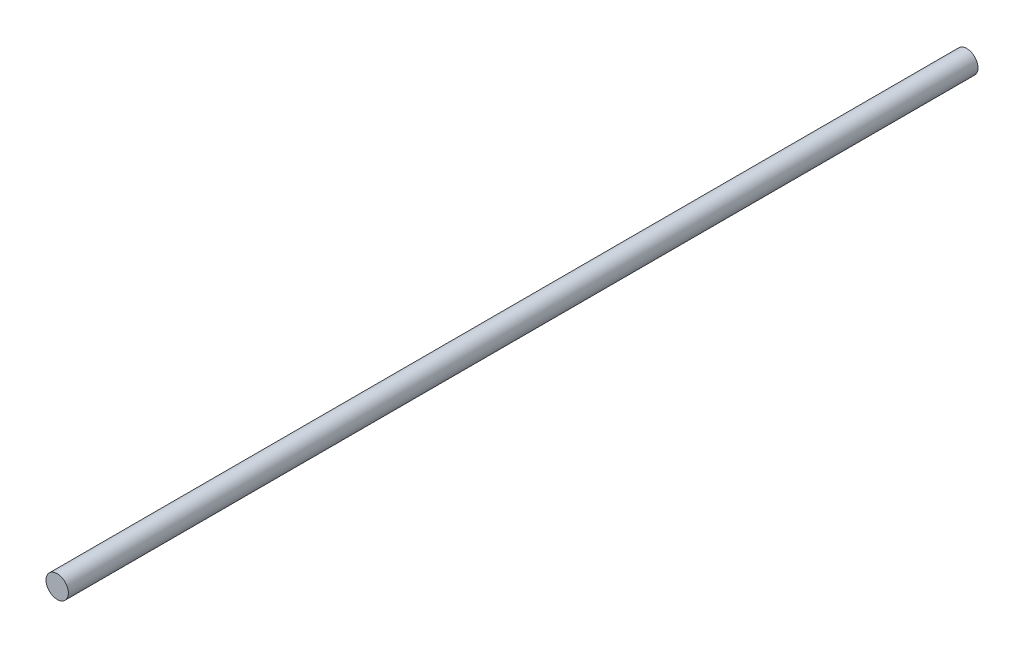
ISO-10303-21;
HEADER;
FILE_DESCRIPTION(('STEP AP214'),'2;1');
FILE_NAME('part.step','',(''),(''),'','','');
FILE_SCHEMA(('AUTOMOTIVE_DESIGN { 1 0 10303 214 1 1 1 1 }'));
ENDSEC;
DATA;
#1=APPLICATION_CONTEXT('core data for automotive mechanical design processes');
#2=APPLICATION_PROTOCOL_DEFINITION('international standard','automotive_design',2000,#1);
#3=PRODUCT_CONTEXT('',#1,'mechanical');
#4=PRODUCT('Part','Part','',(#3));
#5=PRODUCT_RELATED_PRODUCT_CATEGORY('part','',(#4));
#6=PRODUCT_DEFINITION_FORMATION('','',#4);
#7=PRODUCT_DEFINITION_CONTEXT('part definition',#1,'design');
#8=PRODUCT_DEFINITION('design','',#6,#7);
#9=PRODUCT_DEFINITION_SHAPE('','',#8);
#10=(LENGTH_UNIT() NAMED_UNIT(*) SI_UNIT(.MILLI.,.METRE.));
#11=(NAMED_UNIT(*) PLANE_ANGLE_UNIT() SI_UNIT($,.RADIAN.));
#12=(NAMED_UNIT(*) SI_UNIT($,.STERADIAN.) SOLID_ANGLE_UNIT());
#13=UNCERTAINTY_MEASURE_WITH_UNIT(LENGTH_MEASURE(1.E-05),#10,'distance_accuracy_value','');
#14=(GEOMETRIC_REPRESENTATION_CONTEXT(3) GLOBAL_UNCERTAINTY_ASSIGNED_CONTEXT((#13)) GLOBAL_UNIT_ASSIGNED_CONTEXT((#10,
#11,#12)) REPRESENTATION_CONTEXT('',''));
#15=CARTESIAN_POINT('',(0.,0.,0.));
#16=DIRECTION('',(0.,0.,1.));
#17=DIRECTION('',(1.,0.,0.));
#18=AXIS2_PLACEMENT_3D('',#15,#16,#17);
#19=CARTESIAN_POINT('',(0.,0.,258.091653969446));
#20=DIRECTION('',(0.,0.,-1.));
#21=DIRECTION('',(-1.,0.,0.));
#22=AXIS2_PLACEMENT_3D('',#19,#20,#21);
#23=CYLINDRICAL_SURFACE('',#22,3.175);
#24=CARTESIAN_POINT('',(0.,0.,258.091653969446));
#25=DIRECTION('',(0.,0.,1.));
#26=DIRECTION('',(1.,0.,0.));
#27=AXIS2_PLACEMENT_3D('',#24,#25,#26);
#28=CIRCLE('',#27,3.175);
#29=CARTESIAN_POINT('',(3.175,0.,258.091653969446));
#30=VERTEX_POINT('',#29);
#31=EDGE_CURVE('E10',#30,#30,#28,.T.);
#32=ORIENTED_EDGE('',*,*,#31,.F.);
#33=EDGE_LOOP('',(#32));
#34=FACE_BOUND('',#33,.T.);
#35=CARTESIAN_POINT('',(0.,0.,0.));
#36=DIRECTION('',(0.,0.,1.));
#37=DIRECTION('',(1.,0.,0.));
#38=AXIS2_PLACEMENT_3D('',#35,#36,#37);
#39=CIRCLE('',#38,3.175);
#40=CARTESIAN_POINT('',(3.175,0.,0.));
#41=VERTEX_POINT('',#40);
#42=EDGE_CURVE('E46',#41,#41,#39,.T.);
#43=ORIENTED_EDGE('',*,*,#42,.T.);
#44=EDGE_LOOP('',(#43));
#45=FACE_BOUND('',#44,.T.);
#46=ADVANCED_FACE('F43',(#34,#45),#23,.T.);
#47=CARTESIAN_POINT('',(0.,0.,258.091653969446));
#48=DIRECTION('',(0.,0.,1.));
#49=DIRECTION('',(1.,0.,0.));
#50=AXIS2_PLACEMENT_3D('',#47,#48,#49);
#51=PLANE('',#50);
#52=ORIENTED_EDGE('',*,*,#31,.T.);
#53=EDGE_LOOP('',(#52));
#54=FACE_BOUND('',#53,.T.);
#55=ADVANCED_FACE('F58',(#54),#51,.T.);
#56=CARTESIAN_POINT('',(0.,0.,0.));
#57=DIRECTION('',(0.,0.,1.));
#58=DIRECTION('',(1.,0.,0.));
#59=AXIS2_PLACEMENT_3D('',#56,#57,#58);
#60=PLANE('',#59);
#61=ORIENTED_EDGE('',*,*,#42,.F.);
#62=EDGE_LOOP('',(#61));
#63=FACE_BOUND('',#62,.T.);
#64=ADVANCED_FACE('F56',(#63),#60,.F.);
#65=CLOSED_SHELL('',(#46,#55,#64));
#66=MANIFOLD_SOLID_BREP('B2',#65);
#67=ADVANCED_BREP_SHAPE_REPRESENTATION('',(#18,#66),#14);
#68=SHAPE_DEFINITION_REPRESENTATION(#9,#67);
ENDSEC;
END-ISO-10303-21;
